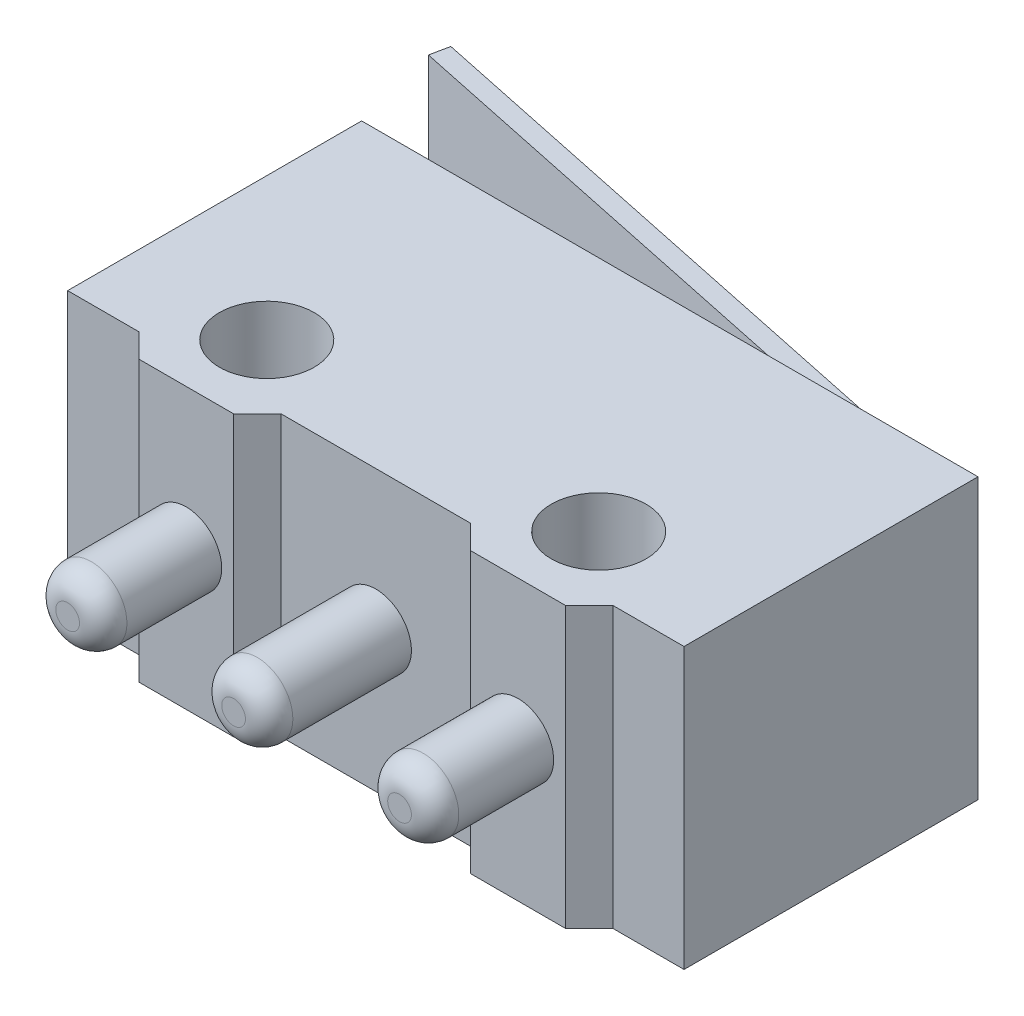
ISO-10303-21;
HEADER;
FILE_DESCRIPTION(('STEP AP214'),'2;1');
FILE_NAME('part.step','',(''),(''),'','','');
FILE_SCHEMA(('AUTOMOTIVE_DESIGN { 1 0 10303 214 1 1 1 1 }'));
ENDSEC;
DATA;
#1=APPLICATION_CONTEXT('core data for automotive mechanical design processes');
#2=APPLICATION_PROTOCOL_DEFINITION('international standard','automotive_design',2000,#1);
#3=PRODUCT_CONTEXT('',#1,'mechanical');
#4=PRODUCT('Part','Part','',(#3));
#5=PRODUCT_RELATED_PRODUCT_CATEGORY('part','',(#4));
#6=PRODUCT_DEFINITION_FORMATION('','',#4);
#7=PRODUCT_DEFINITION_CONTEXT('part definition',#1,'design');
#8=PRODUCT_DEFINITION('design','',#6,#7);
#9=PRODUCT_DEFINITION_SHAPE('','',#8);
#10=(LENGTH_UNIT() NAMED_UNIT(*) SI_UNIT(.MILLI.,.METRE.));
#11=(NAMED_UNIT(*) PLANE_ANGLE_UNIT() SI_UNIT($,.RADIAN.));
#12=(NAMED_UNIT(*) SI_UNIT($,.STERADIAN.) SOLID_ANGLE_UNIT());
#13=UNCERTAINTY_MEASURE_WITH_UNIT(LENGTH_MEASURE(1.E-05),#10,'distance_accuracy_value','');
#14=(GEOMETRIC_REPRESENTATION_CONTEXT(3) GLOBAL_UNCERTAINTY_ASSIGNED_CONTEXT((#13)) GLOBAL_UNIT_ASSIGNED_CONTEXT((#10,
#11,#12)) REPRESENTATION_CONTEXT('',''));
#15=CARTESIAN_POINT('',(0.,0.,0.));
#16=DIRECTION('',(0.,0.,1.));
#17=DIRECTION('',(1.,0.,0.));
#18=AXIS2_PLACEMENT_3D('',#15,#16,#17);
#19=CARTESIAN_POINT('',(5.9,2.95,-3.1));
#20=DIRECTION('',(-0.205748268842548,0.,0.978604950870521));
#21=DIRECTION('',(0.978604950870521,0.,0.205748268842548));
#22=AXIS2_PLACEMENT_3D('',#19,#20,#21);
#23=PLANE('',#22);
#24=DIRECTION('',(-0.978604950870521,0.,-0.205748268842548));
#25=VECTOR('',#24,1.);
#26=CARTESIAN_POINT('',(5.9,-2.45,-3.1));
#27=LINE('',#26,#25);
#28=CARTESIAN_POINT('',(5.9,-2.45,-3.1));
#29=VERTEX_POINT('',#28);
#30=CARTESIAN_POINT('',(-7.41770069246298,-2.45,-5.9));
#31=VERTEX_POINT('',#30);
#32=EDGE_CURVE('E394',#29,#31,#27,.T.);
#33=ORIENTED_EDGE('',*,*,#32,.T.);
#34=DIRECTION('',(0.,-1.,0.));
#35=VECTOR('',#34,1.);
#36=CARTESIAN_POINT('',(-7.41770069246298,2.95,-5.9));
#37=LINE('',#36,#35);
#38=CARTESIAN_POINT('',(-7.41770069246298,2.45,-5.9));
#39=VERTEX_POINT('',#38);
#40=EDGE_CURVE('E225',#39,#31,#37,.T.);
#41=ORIENTED_EDGE('',*,*,#40,.F.);
#42=DIRECTION('',(-0.978604950870521,0.,-0.205748268842548));
#43=VECTOR('',#42,1.);
#44=CARTESIAN_POINT('',(5.9,2.45,-3.1));
#45=LINE('',#44,#43);
#46=CARTESIAN_POINT('',(5.9,2.45,-3.1));
#47=VERTEX_POINT('',#46);
#48=EDGE_CURVE('E402',#47,#39,#45,.T.);
#49=ORIENTED_EDGE('',*,*,#48,.F.);
#50=DIRECTION('',(0.,-1.,0.));
#51=VECTOR('',#50,1.);
#52=CARTESIAN_POINT('',(5.9,2.95,-3.1));
#53=LINE('',#52,#51);
#54=EDGE_CURVE('E228',#47,#29,#53,.T.);
#55=ORIENTED_EDGE('',*,*,#54,.T.);
#56=EDGE_LOOP('',(#33,#41,#49,#55));
#57=FACE_BOUND('',#56,.T.);
#58=ADVANCED_FACE('F36',(#57),#23,.F.);
#59=CARTESIAN_POINT('',(-7.41770069246298,2.95,-5.9));
#60=DIRECTION('',(0.978604950870521,0.,0.205748268842546));
#61=DIRECTION('',(0.205748268842546,0.,-0.978604950870521));
#62=AXIS2_PLACEMENT_3D('',#59,#60,#61);
#63=PLANE('',#62);
#64=DIRECTION('',(-0.205748268842546,0.,0.978604950870521));
#65=VECTOR('',#64,1.);
#66=CARTESIAN_POINT('',(-7.41770069246298,-2.45,-5.9));
#67=LINE('',#66,#65);
#68=CARTESIAN_POINT('',(-7.5,-2.45,-5.50855801965179));
#69=VERTEX_POINT('',#68);
#70=EDGE_CURVE('E388',#31,#69,#67,.T.);
#71=ORIENTED_EDGE('',*,*,#70,.T.);
#72=DIRECTION('',(0.,-1.,0.));
#73=VECTOR('',#72,1.);
#74=CARTESIAN_POINT('',(-7.5,2.95,-5.50855801965179));
#75=LINE('',#74,#73);
#76=CARTESIAN_POINT('',(-7.5,2.45,-5.50855801965179));
#77=VERTEX_POINT('',#76);
#78=EDGE_CURVE('E222',#77,#69,#75,.T.);
#79=ORIENTED_EDGE('',*,*,#78,.F.);
#80=DIRECTION('',(-0.205748268842546,0.,0.978604950870521));
#81=VECTOR('',#80,1.);
#82=CARTESIAN_POINT('',(-7.41770069246298,2.45,-5.9));
#83=LINE('',#82,#81);
#84=EDGE_CURVE('E408',#39,#77,#83,.T.);
#85=ORIENTED_EDGE('',*,*,#84,.F.);
#86=ORIENTED_EDGE('',*,*,#40,.T.);
#87=EDGE_LOOP('',(#71,#79,#85,#86));
#88=FACE_BOUND('',#87,.T.);
#89=ADVANCED_FACE('F266',(#88),#63,.F.);
#90=CARTESIAN_POINT('',(-7.5,2.95,-5.50855801965179));
#91=DIRECTION('',(0.205748268842548,0.,-0.978604950870521));
#92=DIRECTION('',(-0.978604950870521,0.,-0.205748268842548));
#93=AXIS2_PLACEMENT_3D('',#90,#91,#92);
#94=PLANE('',#93);
#95=DIRECTION('',(0.978604950870521,0.,0.205748268842548));
#96=VECTOR('',#95,1.);
#97=CARTESIAN_POINT('',(-7.5,-2.45,-5.50855801965179));
#98=LINE('',#97,#96);
#99=CARTESIAN_POINT('',(3.95587671648355,-2.45,-3.1));
#100=VERTEX_POINT('',#99);
#101=EDGE_CURVE('E378',#69,#100,#98,.T.);
#102=ORIENTED_EDGE('',*,*,#101,.T.);
#103=DIRECTION('',(0.,-1.,0.));
#104=VECTOR('',#103,1.);
#105=CARTESIAN_POINT('',(3.95587671648355,2.95,-3.1));
#106=LINE('',#105,#104);
#107=CARTESIAN_POINT('',(3.95587671648355,2.45,-3.1));
#108=VERTEX_POINT('',#107);
#109=EDGE_CURVE('E220',#108,#100,#106,.T.);
#110=ORIENTED_EDGE('',*,*,#109,.F.);
#111=DIRECTION('',(0.978604950870521,0.,0.205748268842548));
#112=VECTOR('',#111,1.);
#113=CARTESIAN_POINT('',(-7.5,2.45,-5.50855801965179));
#114=LINE('',#113,#112);
#115=EDGE_CURVE('E410',#77,#108,#114,.T.);
#116=ORIENTED_EDGE('',*,*,#115,.F.);
#117=ORIENTED_EDGE('',*,*,#78,.T.);
#118=EDGE_LOOP('',(#102,#110,#116,#117));
#119=FACE_BOUND('',#118,.T.);
#120=ADVANCED_FACE('F272',(#119),#94,.F.);
#121=CARTESIAN_POINT('',(0.,-2.95,0.));
#122=DIRECTION('',(0.,1.,0.));
#123=DIRECTION('',(0.,0.,1.));
#124=AXIS2_PLACEMENT_3D('',#121,#122,#123);
#125=PLANE('',#124);
#126=CARTESIAN_POINT('',(-3.5,-2.95,1.9));
#127=DIRECTION('',(0.,1.,0.));
#128=DIRECTION('',(0.,0.,-1.));
#129=AXIS2_PLACEMENT_3D('',#126,#127,#128);
#130=CIRCLE('',#129,1.);
#131=CARTESIAN_POINT('',(-3.5,-2.95,0.9));
#132=VERTEX_POINT('',#131);
#133=EDGE_CURVE('E416',#132,#132,#130,.T.);
#134=ORIENTED_EDGE('',*,*,#133,.T.);
#135=EDGE_LOOP('',(#134));
#136=FACE_BOUND('',#135,.T.);
#137=CARTESIAN_POINT('',(3.5,-2.95,1.9));
#138=DIRECTION('',(0.,1.,0.));
#139=DIRECTION('',(0.,0.,1.));
#140=AXIS2_PLACEMENT_3D('',#137,#138,#139);
#141=CIRCLE('',#140,1.);
#142=CARTESIAN_POINT('',(3.5,-2.95,2.9));
#143=VERTEX_POINT('',#142);
#144=EDGE_CURVE('E315',#143,#143,#141,.T.);
#145=ORIENTED_EDGE('',*,*,#144,.T.);
#146=EDGE_LOOP('',(#145));
#147=FACE_BOUND('',#146,.T.);
#148=DIRECTION('',(-1.,0.,0.));
#149=VECTOR('',#148,1.);
#150=CARTESIAN_POINT('',(-6.5,-2.95,-3.1));
#151=LINE('',#150,#149);
#152=CARTESIAN_POINT('',(6.5,-2.95,-3.1));
#153=VERTEX_POINT('',#152);
#154=CARTESIAN_POINT('',(-6.5,-2.95,-3.1));
#155=VERTEX_POINT('',#154);
#156=EDGE_CURVE('E105',#153,#155,#151,.T.);
#157=ORIENTED_EDGE('',*,*,#156,.F.);
#158=DIRECTION('',(0.,0.,-1.));
#159=VECTOR('',#158,1.);
#160=CARTESIAN_POINT('',(6.5,-2.95,3.1));
#161=LINE('',#160,#159);
#162=CARTESIAN_POINT('',(6.5,-2.95,3.1));
#163=VERTEX_POINT('',#162);
#164=EDGE_CURVE('E190',#163,#153,#161,.T.);
#165=ORIENTED_EDGE('',*,*,#164,.F.);
#166=DIRECTION('',(1.,0.,0.));
#167=VECTOR('',#166,1.);
#168=CARTESIAN_POINT('',(5.,-2.95,3.1));
#169=LINE('',#168,#167);
#170=CARTESIAN_POINT('',(5.,-2.95,3.1));
#171=VERTEX_POINT('',#170);
#172=EDGE_CURVE('E188',#171,#163,#169,.T.);
#173=ORIENTED_EDGE('',*,*,#172,.F.);
#174=DIRECTION('',(0.707106781186546,0.,-0.707106781186549));
#175=VECTOR('',#174,1.);
#176=CARTESIAN_POINT('',(4.5,-2.95,3.6));
#177=LINE('',#176,#175);
#178=CARTESIAN_POINT('',(4.5,-2.95,3.6));
#179=VERTEX_POINT('',#178);
#180=EDGE_CURVE('E156',#179,#171,#177,.T.);
#181=ORIENTED_EDGE('',*,*,#180,.F.);
#182=DIRECTION('',(1.,0.,0.));
#183=VECTOR('',#182,1.);
#184=CARTESIAN_POINT('',(4.5,-2.95,3.6));
#185=LINE('',#184,#183);
#186=CARTESIAN_POINT('',(2.5,-2.95,3.6));
#187=VERTEX_POINT('',#186);
#188=EDGE_CURVE('E185',#187,#179,#185,.T.);
#189=ORIENTED_EDGE('',*,*,#188,.F.);
#190=DIRECTION('',(0.707106781186547,0.,0.707106781186548));
#191=VECTOR('',#190,1.);
#192=CARTESIAN_POINT('',(2.5,-2.95,3.6));
#193=LINE('',#192,#191);
#194=CARTESIAN_POINT('',(2.,-2.95,3.1));
#195=VERTEX_POINT('',#194);
#196=EDGE_CURVE('E183',#195,#187,#193,.T.);
#197=ORIENTED_EDGE('',*,*,#196,.F.);
#198=DIRECTION('',(1.,0.,0.));
#199=VECTOR('',#198,1.);
#200=CARTESIAN_POINT('',(-2.,-2.95,3.1));
#201=LINE('',#200,#199);
#202=CARTESIAN_POINT('',(-2.,-2.95,3.1));
#203=VERTEX_POINT('',#202);
#204=EDGE_CURVE('E181',#203,#195,#201,.T.);
#205=ORIENTED_EDGE('',*,*,#204,.F.);
#206=DIRECTION('',(0.707106781186547,0.,-0.707106781186548));
#207=VECTOR('',#206,1.);
#208=CARTESIAN_POINT('',(-2.5,-2.95,3.6));
#209=LINE('',#208,#207);
#210=CARTESIAN_POINT('',(-2.5,-2.95,3.6));
#211=VERTEX_POINT('',#210);
#212=EDGE_CURVE('E179',#211,#203,#209,.T.);
#213=ORIENTED_EDGE('',*,*,#212,.F.);
#214=DIRECTION('',(1.,0.,0.));
#215=VECTOR('',#214,1.);
#216=CARTESIAN_POINT('',(-4.5,-2.95,3.6));
#217=LINE('',#216,#215);
#218=CARTESIAN_POINT('',(-4.5,-2.95,3.6));
#219=VERTEX_POINT('',#218);
#220=EDGE_CURVE('E177',#219,#211,#217,.T.);
#221=ORIENTED_EDGE('',*,*,#220,.F.);
#222=DIRECTION('',(0.707106781186546,0.,0.707106781186549));
#223=VECTOR('',#222,1.);
#224=CARTESIAN_POINT('',(-4.5,-2.95,3.6));
#225=LINE('',#224,#223);
#226=CARTESIAN_POINT('',(-5.,-2.95,3.1));
#227=VERTEX_POINT('',#226);
#228=EDGE_CURVE('E175',#227,#219,#225,.T.);
#229=ORIENTED_EDGE('',*,*,#228,.F.);
#230=DIRECTION('',(1.,0.,0.));
#231=VECTOR('',#230,1.);
#232=CARTESIAN_POINT('',(-6.5,-2.95,3.1));
#233=LINE('',#232,#231);
#234=CARTESIAN_POINT('',(-6.5,-2.95,3.1));
#235=VERTEX_POINT('',#234);
#236=EDGE_CURVE('E173',#235,#227,#233,.T.);
#237=ORIENTED_EDGE('',*,*,#236,.F.);
#238=DIRECTION('',(0.,0.,1.));
#239=VECTOR('',#238,1.);
#240=CARTESIAN_POINT('',(-6.5,-2.95,3.1));
#241=LINE('',#240,#239);
#242=EDGE_CURVE('E170',#155,#235,#241,.T.);
#243=ORIENTED_EDGE('',*,*,#242,.F.);
#244=EDGE_LOOP('',(#157,#165,#173,#181,#189,#197,#205,#213,#221,#229,#237,#243));
#245=FACE_BOUND('',#244,.T.);
#246=ADVANCED_FACE('F304',(#136,#147,#245),#125,.F.);
#247=CARTESIAN_POINT('',(0.,2.95,0.));
#248=DIRECTION('',(0.,1.,0.));
#249=DIRECTION('',(0.,0.,1.));
#250=AXIS2_PLACEMENT_3D('',#247,#248,#249);
#251=PLANE('',#250);
#252=DIRECTION('',(-1.,0.,0.));
#253=VECTOR('',#252,1.);
#254=CARTESIAN_POINT('',(5.9,2.95,-3.1));
#255=LINE('',#254,#253);
#256=CARTESIAN_POINT('',(6.5,2.95,-3.1));
#257=VERTEX_POINT('',#256);
#258=CARTESIAN_POINT('',(-6.5,2.95,-3.1));
#259=VERTEX_POINT('',#258);
#260=EDGE_CURVE('E111',#257,#259,#255,.T.);
#261=ORIENTED_EDGE('',*,*,#260,.T.);
#262=DIRECTION('',(0.,0.,1.));
#263=VECTOR('',#262,1.);
#264=CARTESIAN_POINT('',(-6.5,2.95,3.1));
#265=LINE('',#264,#263);
#266=CARTESIAN_POINT('',(-6.5,2.95,3.1));
#267=VERTEX_POINT('',#266);
#268=EDGE_CURVE('E310',#259,#267,#265,.T.);
#269=ORIENTED_EDGE('',*,*,#268,.T.);
#270=DIRECTION('',(1.,0.,0.));
#271=VECTOR('',#270,1.);
#272=CARTESIAN_POINT('',(-6.5,2.95,3.1));
#273=LINE('',#272,#271);
#274=CARTESIAN_POINT('',(-5.,2.95,3.1));
#275=VERTEX_POINT('',#274);
#276=EDGE_CURVE('E312',#267,#275,#273,.T.);
#277=ORIENTED_EDGE('',*,*,#276,.T.);
#278=DIRECTION('',(0.707106781186546,0.,0.707106781186549));
#279=VECTOR('',#278,1.);
#280=CARTESIAN_POINT('',(-4.5,2.95,3.6));
#281=LINE('',#280,#279);
#282=CARTESIAN_POINT('',(-4.5,2.95,3.6));
#283=VERTEX_POINT('',#282);
#284=EDGE_CURVE('E319',#275,#283,#281,.T.);
#285=ORIENTED_EDGE('',*,*,#284,.T.);
#286=DIRECTION('',(1.,0.,0.));
#287=VECTOR('',#286,1.);
#288=CARTESIAN_POINT('',(-4.5,2.95,3.6));
#289=LINE('',#288,#287);
#290=CARTESIAN_POINT('',(-2.5,2.95,3.6));
#291=VERTEX_POINT('',#290);
#292=EDGE_CURVE('E321',#283,#291,#289,.T.);
#293=ORIENTED_EDGE('',*,*,#292,.T.);
#294=DIRECTION('',(0.707106781186547,0.,-0.707106781186548));
#295=VECTOR('',#294,1.);
#296=CARTESIAN_POINT('',(-2.5,2.95,3.6));
#297=LINE('',#296,#295);
#298=CARTESIAN_POINT('',(-2.,2.95,3.1));
#299=VERTEX_POINT('',#298);
#300=EDGE_CURVE('E323',#291,#299,#297,.T.);
#301=ORIENTED_EDGE('',*,*,#300,.T.);
#302=DIRECTION('',(1.,0.,0.));
#303=VECTOR('',#302,1.);
#304=CARTESIAN_POINT('',(-2.,2.95,3.1));
#305=LINE('',#304,#303);
#306=CARTESIAN_POINT('',(2.,2.95,3.1));
#307=VERTEX_POINT('',#306);
#308=EDGE_CURVE('E325',#299,#307,#305,.T.);
#309=ORIENTED_EDGE('',*,*,#308,.T.);
#310=DIRECTION('',(0.707106781186547,0.,0.707106781186548));
#311=VECTOR('',#310,1.);
#312=CARTESIAN_POINT('',(2.5,2.95,3.6));
#313=LINE('',#312,#311);
#314=CARTESIAN_POINT('',(2.5,2.95,3.6));
#315=VERTEX_POINT('',#314);
#316=EDGE_CURVE('E327',#307,#315,#313,.T.);
#317=ORIENTED_EDGE('',*,*,#316,.T.);
#318=DIRECTION('',(1.,0.,0.));
#319=VECTOR('',#318,1.);
#320=CARTESIAN_POINT('',(4.5,2.95,3.6));
#321=LINE('',#320,#319);
#322=CARTESIAN_POINT('',(4.5,2.95,3.6));
#323=VERTEX_POINT('',#322);
#324=EDGE_CURVE('E147',#315,#323,#321,.T.);
#325=ORIENTED_EDGE('',*,*,#324,.T.);
#326=DIRECTION('',(0.707106781186546,0.,-0.707106781186549));
#327=VECTOR('',#326,1.);
#328=CARTESIAN_POINT('',(4.5,2.95,3.6));
#329=LINE('',#328,#327);
#330=CARTESIAN_POINT('',(5.,2.95,3.1));
#331=VERTEX_POINT('',#330);
#332=EDGE_CURVE('E139',#323,#331,#329,.T.);
#333=ORIENTED_EDGE('',*,*,#332,.T.);
#334=DIRECTION('',(1.,0.,0.));
#335=VECTOR('',#334,1.);
#336=CARTESIAN_POINT('',(5.,2.95,3.1));
#337=LINE('',#336,#335);
#338=CARTESIAN_POINT('',(6.5,2.95,3.1));
#339=VERTEX_POINT('',#338);
#340=EDGE_CURVE('E144',#331,#339,#337,.T.);
#341=ORIENTED_EDGE('',*,*,#340,.T.);
#342=DIRECTION('',(0.,0.,-1.));
#343=VECTOR('',#342,1.);
#344=CARTESIAN_POINT('',(6.5,2.95,3.1));
#345=LINE('',#344,#343);
#346=EDGE_CURVE('E60',#339,#257,#345,.T.);
#347=ORIENTED_EDGE('',*,*,#346,.T.);
#348=EDGE_LOOP('',(#261,#269,#277,#285,#293,#301,#309,#317,#325,#333,#341,#347));
#349=FACE_BOUND('',#348,.T.);
#350=CARTESIAN_POINT('',(3.5,2.95,1.9));
#351=DIRECTION('',(0.,1.,0.));
#352=DIRECTION('',(0.,0.,1.));
#353=AXIS2_PLACEMENT_3D('',#350,#351,#352);
#354=CIRCLE('',#353,1.);
#355=CARTESIAN_POINT('',(3.5,2.95,2.9));
#356=VERTEX_POINT('',#355);
#357=EDGE_CURVE('E171',#356,#356,#354,.T.);
#358=ORIENTED_EDGE('',*,*,#357,.F.);
#359=EDGE_LOOP('',(#358));
#360=FACE_BOUND('',#359,.T.);
#361=CARTESIAN_POINT('',(-3.5,2.95,1.9));
#362=DIRECTION('',(0.,1.,0.));
#363=DIRECTION('',(0.,0.,-1.));
#364=AXIS2_PLACEMENT_3D('',#361,#362,#363);
#365=CIRCLE('',#364,1.);
#366=CARTESIAN_POINT('',(-3.5,2.95,0.9));
#367=VERTEX_POINT('',#366);
#368=EDGE_CURVE('E417',#367,#367,#365,.T.);
#369=ORIENTED_EDGE('',*,*,#368,.F.);
#370=EDGE_LOOP('',(#369));
#371=FACE_BOUND('',#370,.T.);
#372=ADVANCED_FACE('F141',(#349,#360,#371),#251,.T.);
#373=CARTESIAN_POINT('',(-6.5,2.95,-3.1));
#374=DIRECTION('',(0.,0.,1.));
#375=DIRECTION('',(1.,0.,0.));
#376=AXIS2_PLACEMENT_3D('',#373,#374,#375);
#377=PLANE('',#376);
#378=DIRECTION('',(0.,-1.,0.));
#379=VECTOR('',#378,1.);
#380=CARTESIAN_POINT('',(6.5,2.95,-3.1));
#381=LINE('',#380,#379);
#382=EDGE_CURVE('E165',#257,#153,#381,.T.);
#383=ORIENTED_EDGE('',*,*,#382,.T.);
#384=ORIENTED_EDGE('',*,*,#156,.T.);
#385=DIRECTION('',(0.,-1.,0.));
#386=VECTOR('',#385,1.);
#387=CARTESIAN_POINT('',(-6.5,2.95,-3.1));
#388=LINE('',#387,#386);
#389=EDGE_CURVE('E217',#259,#155,#388,.T.);
#390=ORIENTED_EDGE('',*,*,#389,.F.);
#391=ORIENTED_EDGE('',*,*,#260,.F.);
#392=EDGE_LOOP('',(#383,#384,#390,#391));
#393=FACE_BOUND('',#392,.T.);
#394=DIRECTION('',(1.,0.,0.));
#395=VECTOR('',#394,1.);
#396=CARTESIAN_POINT('',(5.9,-2.45,-3.1));
#397=LINE('',#396,#395);
#398=EDGE_CURVE('E389',#100,#29,#397,.T.);
#399=ORIENTED_EDGE('',*,*,#398,.T.);
#400=ORIENTED_EDGE('',*,*,#54,.F.);
#401=DIRECTION('',(1.,0.,0.));
#402=VECTOR('',#401,1.);
#403=CARTESIAN_POINT('',(5.9,2.45,-3.1));
#404=LINE('',#403,#402);
#405=EDGE_CURVE('E51',#108,#47,#404,.T.);
#406=ORIENTED_EDGE('',*,*,#405,.F.);
#407=ORIENTED_EDGE('',*,*,#109,.T.);
#408=EDGE_LOOP('',(#399,#400,#406,#407));
#409=FACE_BOUND('',#408,.T.);
#410=ADVANCED_FACE('F308',(#393,#409),#377,.F.);
#411=CARTESIAN_POINT('',(-6.5,2.95,3.1));
#412=DIRECTION('',(1.,0.,0.));
#413=DIRECTION('',(0.,0.,-1.));
#414=AXIS2_PLACEMENT_3D('',#411,#412,#413);
#415=PLANE('',#414);
#416=ORIENTED_EDGE('',*,*,#242,.T.);
#417=DIRECTION('',(0.,-1.,0.));
#418=VECTOR('',#417,1.);
#419=CARTESIAN_POINT('',(-6.5,2.95,3.1));
#420=LINE('',#419,#418);
#421=EDGE_CURVE('E214',#267,#235,#420,.T.);
#422=ORIENTED_EDGE('',*,*,#421,.F.);
#423=ORIENTED_EDGE('',*,*,#268,.F.);
#424=ORIENTED_EDGE('',*,*,#389,.T.);
#425=EDGE_LOOP('',(#416,#422,#423,#424));
#426=FACE_BOUND('',#425,.T.);
#427=ADVANCED_FACE('F357',(#426),#415,.F.);
#428=CARTESIAN_POINT('',(-6.5,2.95,3.1));
#429=DIRECTION('',(0.,0.,-1.));
#430=DIRECTION('',(-1.,0.,0.));
#431=AXIS2_PLACEMENT_3D('',#428,#429,#430);
#432=PLANE('',#431);
#433=ORIENTED_EDGE('',*,*,#236,.T.);
#434=DIRECTION('',(0.,-1.,0.));
#435=VECTOR('',#434,1.);
#436=CARTESIAN_POINT('',(-5.,2.95,3.1));
#437=LINE('',#436,#435);
#438=EDGE_CURVE('E211',#275,#227,#437,.T.);
#439=ORIENTED_EDGE('',*,*,#438,.F.);
#440=ORIENTED_EDGE('',*,*,#276,.F.);
#441=ORIENTED_EDGE('',*,*,#421,.T.);
#442=EDGE_LOOP('',(#433,#439,#440,#441));
#443=FACE_BOUND('',#442,.T.);
#444=ADVANCED_FACE('F354',(#443),#432,.F.);
#445=CARTESIAN_POINT('',(-4.5,2.95,3.6));
#446=DIRECTION('',(0.707106781186549,0.,-0.707106781186546));
#447=DIRECTION('',(-0.707106781186546,0.,-0.707106781186549));
#448=AXIS2_PLACEMENT_3D('',#445,#446,#447);
#449=PLANE('',#448);
#450=ORIENTED_EDGE('',*,*,#228,.T.);
#451=DIRECTION('',(0.,-1.,0.));
#452=VECTOR('',#451,1.);
#453=CARTESIAN_POINT('',(-4.5,2.95,3.6));
#454=LINE('',#453,#452);
#455=EDGE_CURVE('E208',#283,#219,#454,.T.);
#456=ORIENTED_EDGE('',*,*,#455,.F.);
#457=ORIENTED_EDGE('',*,*,#284,.F.);
#458=ORIENTED_EDGE('',*,*,#438,.T.);
#459=EDGE_LOOP('',(#450,#456,#457,#458));
#460=FACE_BOUND('',#459,.T.);
#461=ADVANCED_FACE('F349',(#460),#449,.F.);
#462=CARTESIAN_POINT('',(-4.5,2.95,3.6));
#463=DIRECTION('',(0.,0.,-1.));
#464=DIRECTION('',(-1.,0.,0.));
#465=AXIS2_PLACEMENT_3D('',#462,#463,#464);
#466=PLANE('',#465);
#467=CARTESIAN_POINT('',(-3.5,0.,3.6));
#468=DIRECTION('',(0.,0.,-1.));
#469=DIRECTION('',(-1.,0.,0.));
#470=AXIS2_PLACEMENT_3D('',#467,#468,#469);
#471=CIRCLE('',#470,0.75);
#472=CARTESIAN_POINT('',(-4.25,0.,3.6));
#473=VERTEX_POINT('',#472);
#474=EDGE_CURVE('E234',#473,#473,#471,.F.);
#475=ORIENTED_EDGE('',*,*,#474,.F.);
#476=EDGE_LOOP('',(#475));
#477=FACE_BOUND('',#476,.T.);
#478=ORIENTED_EDGE('',*,*,#220,.T.);
#479=DIRECTION('',(0.,-1.,0.));
#480=VECTOR('',#479,1.);
#481=CARTESIAN_POINT('',(-2.5,2.95,3.6));
#482=LINE('',#481,#480);
#483=EDGE_CURVE('E205',#291,#211,#482,.T.);
#484=ORIENTED_EDGE('',*,*,#483,.F.);
#485=ORIENTED_EDGE('',*,*,#292,.F.);
#486=ORIENTED_EDGE('',*,*,#455,.T.);
#487=EDGE_LOOP('',(#478,#484,#485,#486));
#488=FACE_BOUND('',#487,.T.);
#489=ADVANCED_FACE('F344',(#477,#488),#466,.F.);
#490=CARTESIAN_POINT('',(-2.5,2.95,3.6));
#491=DIRECTION('',(-0.707106781186548,0.,-0.707106781186547));
#492=DIRECTION('',(-0.707106781186547,0.,0.707106781186548));
#493=AXIS2_PLACEMENT_3D('',#490,#491,#492);
#494=PLANE('',#493);
#495=ORIENTED_EDGE('',*,*,#212,.T.);
#496=DIRECTION('',(0.,-1.,0.));
#497=VECTOR('',#496,1.);
#498=CARTESIAN_POINT('',(-2.,2.95,3.1));
#499=LINE('',#498,#497);
#500=EDGE_CURVE('E202',#299,#203,#499,.T.);
#501=ORIENTED_EDGE('',*,*,#500,.F.);
#502=ORIENTED_EDGE('',*,*,#300,.F.);
#503=ORIENTED_EDGE('',*,*,#483,.T.);
#504=EDGE_LOOP('',(#495,#501,#502,#503));
#505=FACE_BOUND('',#504,.T.);
#506=ADVANCED_FACE('F340',(#505),#494,.F.);
#507=CARTESIAN_POINT('',(-2.,2.95,3.1));
#508=DIRECTION('',(0.,0.,-1.));
#509=DIRECTION('',(-1.,0.,0.));
#510=AXIS2_PLACEMENT_3D('',#507,#508,#509);
#511=PLANE('',#510);
#512=CARTESIAN_POINT('',(0.,0.,3.1));
#513=DIRECTION('',(0.,0.,-1.));
#514=DIRECTION('',(-1.,0.,0.));
#515=AXIS2_PLACEMENT_3D('',#512,#513,#514);
#516=CIRCLE('',#515,0.75);
#517=CARTESIAN_POINT('',(-0.75,0.,3.1));
#518=VERTEX_POINT('',#517);
#519=EDGE_CURVE('E231',#518,#518,#516,.F.);
#520=ORIENTED_EDGE('',*,*,#519,.F.);
#521=EDGE_LOOP('',(#520));
#522=FACE_BOUND('',#521,.T.);
#523=ORIENTED_EDGE('',*,*,#204,.T.);
#524=DIRECTION('',(0.,-1.,0.));
#525=VECTOR('',#524,1.);
#526=CARTESIAN_POINT('',(2.,2.95,3.1));
#527=LINE('',#526,#525);
#528=EDGE_CURVE('E199',#307,#195,#527,.T.);
#529=ORIENTED_EDGE('',*,*,#528,.F.);
#530=ORIENTED_EDGE('',*,*,#308,.F.);
#531=ORIENTED_EDGE('',*,*,#500,.T.);
#532=EDGE_LOOP('',(#523,#529,#530,#531));
#533=FACE_BOUND('',#532,.T.);
#534=ADVANCED_FACE('F336',(#522,#533),#511,.F.);
#535=CARTESIAN_POINT('',(2.5,2.95,3.6));
#536=DIRECTION('',(0.707106781186548,0.,-0.707106781186547));
#537=DIRECTION('',(-0.707106781186547,0.,-0.707106781186548));
#538=AXIS2_PLACEMENT_3D('',#535,#536,#537);
#539=PLANE('',#538);
#540=ORIENTED_EDGE('',*,*,#196,.T.);
#541=DIRECTION('',(0.,-1.,0.));
#542=VECTOR('',#541,1.);
#543=CARTESIAN_POINT('',(2.5,2.95,3.6));
#544=LINE('',#543,#542);
#545=EDGE_CURVE('E196',#315,#187,#544,.T.);
#546=ORIENTED_EDGE('',*,*,#545,.F.);
#547=ORIENTED_EDGE('',*,*,#316,.F.);
#548=ORIENTED_EDGE('',*,*,#528,.T.);
#549=EDGE_LOOP('',(#540,#546,#547,#548));
#550=FACE_BOUND('',#549,.T.);
#551=ADVANCED_FACE('F299',(#550),#539,.F.);
#552=CARTESIAN_POINT('',(4.5,2.95,3.6));
#553=DIRECTION('',(0.,0.,-1.));
#554=DIRECTION('',(-1.,0.,0.));
#555=AXIS2_PLACEMENT_3D('',#552,#553,#554);
#556=PLANE('',#555);
#557=CARTESIAN_POINT('',(3.5,0.,3.6));
#558=DIRECTION('',(0.,0.,-1.));
#559=DIRECTION('',(-1.,0.,0.));
#560=AXIS2_PLACEMENT_3D('',#557,#558,#559);
#561=CIRCLE('',#560,0.750000000000001);
#562=CARTESIAN_POINT('',(2.75,0.,3.6));
#563=VERTEX_POINT('',#562);
#564=EDGE_CURVE('E237',#563,#563,#561,.F.);
#565=ORIENTED_EDGE('',*,*,#564,.F.);
#566=EDGE_LOOP('',(#565));
#567=FACE_BOUND('',#566,.T.);
#568=ORIENTED_EDGE('',*,*,#188,.T.);
#569=DIRECTION('',(0.,-1.,0.));
#570=VECTOR('',#569,1.);
#571=CARTESIAN_POINT('',(4.5,2.95,3.6));
#572=LINE('',#571,#570);
#573=EDGE_CURVE('E159',#323,#179,#572,.T.);
#574=ORIENTED_EDGE('',*,*,#573,.F.);
#575=ORIENTED_EDGE('',*,*,#324,.F.);
#576=ORIENTED_EDGE('',*,*,#545,.T.);
#577=EDGE_LOOP('',(#568,#574,#575,#576));
#578=FACE_BOUND('',#577,.T.);
#579=ADVANCED_FACE('F296',(#567,#578),#556,.F.);
#580=CARTESIAN_POINT('',(4.5,2.95,3.6));
#581=DIRECTION('',(-0.707106781186549,0.,-0.707106781186546));
#582=DIRECTION('',(-0.707106781186546,0.,0.707106781186549));
#583=AXIS2_PLACEMENT_3D('',#580,#581,#582);
#584=PLANE('',#583);
#585=ORIENTED_EDGE('',*,*,#180,.T.);
#586=DIRECTION('',(0.,-1.,0.));
#587=VECTOR('',#586,1.);
#588=CARTESIAN_POINT('',(5.,2.95,3.1));
#589=LINE('',#588,#587);
#590=EDGE_CURVE('E153',#331,#171,#589,.T.);
#591=ORIENTED_EDGE('',*,*,#590,.F.);
#592=ORIENTED_EDGE('',*,*,#332,.F.);
#593=ORIENTED_EDGE('',*,*,#573,.T.);
#594=EDGE_LOOP('',(#585,#591,#592,#593));
#595=FACE_BOUND('',#594,.T.);
#596=ADVANCED_FACE('F154',(#595),#584,.F.);
#597=CARTESIAN_POINT('',(5.,2.95,3.1));
#598=DIRECTION('',(0.,0.,-1.));
#599=DIRECTION('',(-1.,0.,0.));
#600=AXIS2_PLACEMENT_3D('',#597,#598,#599);
#601=PLANE('',#600);
#602=ORIENTED_EDGE('',*,*,#172,.T.);
#603=DIRECTION('',(0.,-1.,0.));
#604=VECTOR('',#603,1.);
#605=CARTESIAN_POINT('',(6.5,2.95,3.1));
#606=LINE('',#605,#604);
#607=EDGE_CURVE('E160',#339,#163,#606,.T.);
#608=ORIENTED_EDGE('',*,*,#607,.F.);
#609=ORIENTED_EDGE('',*,*,#340,.F.);
#610=ORIENTED_EDGE('',*,*,#590,.T.);
#611=EDGE_LOOP('',(#602,#608,#609,#610));
#612=FACE_BOUND('',#611,.T.);
#613=ADVANCED_FACE('F162',(#612),#601,.F.);
#614=CARTESIAN_POINT('',(6.5,2.95,3.1));
#615=DIRECTION('',(-1.,0.,0.));
#616=DIRECTION('',(0.,0.,1.));
#617=AXIS2_PLACEMENT_3D('',#614,#615,#616);
#618=PLANE('',#617);
#619=ORIENTED_EDGE('',*,*,#164,.T.);
#620=ORIENTED_EDGE('',*,*,#382,.F.);
#621=ORIENTED_EDGE('',*,*,#346,.F.);
#622=ORIENTED_EDGE('',*,*,#607,.T.);
#623=EDGE_LOOP('',(#619,#620,#621,#622));
#624=FACE_BOUND('',#623,.T.);
#625=ADVANCED_FACE('F306',(#624),#618,.F.);
#626=CARTESIAN_POINT('',(3.5,2.95,1.9));
#627=DIRECTION('',(0.,-1.,0.));
#628=DIRECTION('',(0.,0.,-1.));
#629=AXIS2_PLACEMENT_3D('',#626,#627,#628);
#630=CYLINDRICAL_SURFACE('',#629,1.);
#631=ORIENTED_EDGE('',*,*,#357,.T.);
#632=EDGE_LOOP('',(#631));
#633=FACE_BOUND('',#632,.T.);
#634=ORIENTED_EDGE('',*,*,#144,.F.);
#635=EDGE_LOOP('',(#634));
#636=FACE_BOUND('',#635,.T.);
#637=ADVANCED_FACE('F428',(#633,#636),#630,.F.);
#638=CARTESIAN_POINT('',(-3.5,2.95,1.9));
#639=DIRECTION('',(0.,-1.,0.));
#640=DIRECTION('',(0.,0.,-1.));
#641=AXIS2_PLACEMENT_3D('',#638,#639,#640);
#642=CYLINDRICAL_SURFACE('',#641,1.);
#643=ORIENTED_EDGE('',*,*,#368,.T.);
#644=EDGE_LOOP('',(#643));
#645=FACE_BOUND('',#644,.T.);
#646=ORIENTED_EDGE('',*,*,#133,.F.);
#647=EDGE_LOOP('',(#646));
#648=FACE_BOUND('',#647,.T.);
#649=ADVANCED_FACE('F430',(#645,#648),#642,.F.);
#650=CARTESIAN_POINT('',(0.,2.45,0.));
#651=DIRECTION('',(0.,1.,0.));
#652=DIRECTION('',(0.,0.,1.));
#653=AXIS2_PLACEMENT_3D('',#650,#651,#652);
#654=PLANE('',#653);
#655=ORIENTED_EDGE('',*,*,#48,.T.);
#656=ORIENTED_EDGE('',*,*,#84,.T.);
#657=ORIENTED_EDGE('',*,*,#115,.T.);
#658=ORIENTED_EDGE('',*,*,#405,.T.);
#659=EDGE_LOOP('',(#655,#656,#657,#658));
#660=FACE_BOUND('',#659,.T.);
#661=ADVANCED_FACE('F436',(#660),#654,.T.);
#662=CARTESIAN_POINT('',(0.,-2.45,0.));
#663=DIRECTION('',(0.,-1.,0.));
#664=DIRECTION('',(0.,0.,1.));
#665=AXIS2_PLACEMENT_3D('',#662,#663,#664);
#666=PLANE('',#665);
#667=ORIENTED_EDGE('',*,*,#32,.F.);
#668=ORIENTED_EDGE('',*,*,#398,.F.);
#669=ORIENTED_EDGE('',*,*,#101,.F.);
#670=ORIENTED_EDGE('',*,*,#70,.F.);
#671=EDGE_LOOP('',(#667,#668,#669,#670));
#672=FACE_BOUND('',#671,.T.);
#673=ADVANCED_FACE('F396',(#672),#666,.T.);
#674=CARTESIAN_POINT('',(0.,0.,6.1));
#675=DIRECTION('',(0.,0.,-1.));
#676=DIRECTION('',(-1.,0.,0.));
#677=AXIS2_PLACEMENT_3D('',#674,#675,#676);
#678=CYLINDRICAL_SURFACE('',#677,0.75);
#679=CARTESIAN_POINT('',(0.,0.,5.6));
#680=DIRECTION('',(0.,0.,1.));
#681=DIRECTION('',(1.,0.,0.));
#682=AXIS2_PLACEMENT_3D('',#679,#680,#681);
#683=CIRCLE('',#682,0.75);
#684=CARTESIAN_POINT('',(0.75,0.,5.6));
#685=VERTEX_POINT('',#684);
#686=EDGE_CURVE('E249',#685,#685,#683,.F.);
#687=ORIENTED_EDGE('',*,*,#686,.T.);
#688=EDGE_LOOP('',(#687));
#689=FACE_BOUND('',#688,.T.);
#690=ORIENTED_EDGE('',*,*,#519,.T.);
#691=EDGE_LOOP('',(#690));
#692=FACE_BOUND('',#691,.T.);
#693=ADVANCED_FACE('F555',(#689,#692),#678,.T.);
#694=CARTESIAN_POINT('',(0.,0.,6.1));
#695=DIRECTION('',(0.,0.,1.));
#696=DIRECTION('',(1.,0.,0.));
#697=AXIS2_PLACEMENT_3D('',#694,#695,#696);
#698=PLANE('',#697);
#699=CARTESIAN_POINT('',(0.,0.,6.1));
#700=DIRECTION('',(0.,0.,1.));
#701=DIRECTION('',(1.,0.,0.));
#702=AXIS2_PLACEMENT_3D('',#699,#700,#701);
#703=CIRCLE('',#702,0.25);
#704=CARTESIAN_POINT('',(0.25,0.,6.1));
#705=VERTEX_POINT('',#704);
#706=EDGE_CURVE('E246',#705,#705,#703,.T.);
#707=ORIENTED_EDGE('',*,*,#706,.T.);
#708=EDGE_LOOP('',(#707));
#709=FACE_BOUND('',#708,.T.);
#710=ADVANCED_FACE('F564',(#709),#698,.T.);
#711=CARTESIAN_POINT('',(-3.5,0.,6.1));
#712=DIRECTION('',(0.,0.,-1.));
#713=DIRECTION('',(-1.,0.,0.));
#714=AXIS2_PLACEMENT_3D('',#711,#712,#713);
#715=CYLINDRICAL_SURFACE('',#714,0.75);
#716=CARTESIAN_POINT('',(-3.5,0.,5.6));
#717=DIRECTION('',(0.,0.,1.));
#718=DIRECTION('',(1.,0.,0.));
#719=AXIS2_PLACEMENT_3D('',#716,#717,#718);
#720=CIRCLE('',#719,0.75);
#721=CARTESIAN_POINT('',(-2.75,0.,5.6));
#722=VERTEX_POINT('',#721);
#723=EDGE_CURVE('E11',#722,#722,#720,.F.);
#724=ORIENTED_EDGE('',*,*,#723,.T.);
#725=EDGE_LOOP('',(#724));
#726=FACE_BOUND('',#725,.T.);
#727=ORIENTED_EDGE('',*,*,#474,.T.);
#728=EDGE_LOOP('',(#727));
#729=FACE_BOUND('',#728,.T.);
#730=ADVANCED_FACE('F571',(#726,#729),#715,.T.);
#731=CARTESIAN_POINT('',(-3.5,0.,6.1));
#732=DIRECTION('',(0.,0.,1.));
#733=DIRECTION('',(1.,0.,0.));
#734=AXIS2_PLACEMENT_3D('',#731,#732,#733);
#735=PLANE('',#734);
#736=CARTESIAN_POINT('',(-3.5,0.,6.1));
#737=DIRECTION('',(0.,0.,1.));
#738=DIRECTION('',(1.,0.,0.));
#739=AXIS2_PLACEMENT_3D('',#736,#737,#738);
#740=CIRCLE('',#739,0.25);
#741=CARTESIAN_POINT('',(-3.25,0.,6.1));
#742=VERTEX_POINT('',#741);
#743=EDGE_CURVE('E44',#742,#742,#740,.T.);
#744=ORIENTED_EDGE('',*,*,#743,.T.);
#745=EDGE_LOOP('',(#744));
#746=FACE_BOUND('',#745,.T.);
#747=ADVANCED_FACE('F254',(#746),#735,.T.);
#748=CARTESIAN_POINT('',(3.5,0.,6.1));
#749=DIRECTION('',(0.,0.,-1.));
#750=DIRECTION('',(-1.,0.,0.));
#751=AXIS2_PLACEMENT_3D('',#748,#749,#750);
#752=CYLINDRICAL_SURFACE('',#751,0.750000000000001);
#753=CARTESIAN_POINT('',(3.5,0.,5.6));
#754=DIRECTION('',(0.,0.,-1.));
#755=DIRECTION('',(-1.,0.,0.));
#756=AXIS2_PLACEMENT_3D('',#753,#754,#755);
#757=CIRCLE('',#756,0.750000000000001);
#758=CARTESIAN_POINT('',(2.75,0.,5.6));
#759=VERTEX_POINT('',#758);
#760=EDGE_CURVE('E243',#759,#759,#757,.T.);
#761=ORIENTED_EDGE('',*,*,#760,.T.);
#762=EDGE_LOOP('',(#761));
#763=FACE_BOUND('',#762,.T.);
#764=ORIENTED_EDGE('',*,*,#564,.T.);
#765=EDGE_LOOP('',(#764));
#766=FACE_BOUND('',#765,.T.);
#767=ADVANCED_FACE('F284',(#763,#766),#752,.T.);
#768=CARTESIAN_POINT('',(3.5,0.,6.1));
#769=DIRECTION('',(0.,0.,-1.));
#770=DIRECTION('',(-1.,0.,0.));
#771=AXIS2_PLACEMENT_3D('',#768,#769,#770);
#772=PLANE('',#771);
#773=CARTESIAN_POINT('',(3.5,0.,6.1));
#774=DIRECTION('',(0.,0.,-1.));
#775=DIRECTION('',(-1.,0.,0.));
#776=AXIS2_PLACEMENT_3D('',#773,#774,#775);
#777=CIRCLE('',#776,0.250000000000001);
#778=CARTESIAN_POINT('',(3.25,0.,6.1));
#779=VERTEX_POINT('',#778);
#780=EDGE_CURVE('E240',#779,#779,#777,.F.);
#781=ORIENTED_EDGE('',*,*,#780,.T.);
#782=EDGE_LOOP('',(#781));
#783=FACE_BOUND('',#782,.T.);
#784=ADVANCED_FACE('F279',(#783),#772,.F.);
#785=CARTESIAN_POINT('',(3.5,0.,5.6));
#786=DIRECTION('',(0.,0.,-1.));
#787=DIRECTION('',(-1.,0.,0.));
#788=AXIS2_PLACEMENT_3D('',#785,#786,#787);
#789=DEGENERATE_TOROIDAL_SURFACE('',#788,0.250000000000001,0.5,.T.);
#790=ORIENTED_EDGE('',*,*,#760,.F.);
#791=EDGE_LOOP('',(#790));
#792=FACE_BOUND('',#791,.T.);
#793=ORIENTED_EDGE('',*,*,#780,.F.);
#794=EDGE_LOOP('',(#793));
#795=FACE_BOUND('',#794,.T.);
#796=ADVANCED_FACE('F262',(#792,#795),#789,.T.);
#797=CARTESIAN_POINT('',(0.,0.,5.6));
#798=DIRECTION('',(0.,0.,1.));
#799=DIRECTION('',(1.,0.,0.));
#800=AXIS2_PLACEMENT_3D('',#797,#798,#799);
#801=DEGENERATE_TOROIDAL_SURFACE('',#800,0.25,0.5,.T.);
#802=ORIENTED_EDGE('',*,*,#686,.F.);
#803=EDGE_LOOP('',(#802));
#804=FACE_BOUND('',#803,.T.);
#805=ORIENTED_EDGE('',*,*,#706,.F.);
#806=EDGE_LOOP('',(#805));
#807=FACE_BOUND('',#806,.T.);
#808=ADVANCED_FACE('F257',(#804,#807),#801,.T.);
#809=CARTESIAN_POINT('',(-3.5,0.,5.6));
#810=DIRECTION('',(0.,0.,1.));
#811=DIRECTION('',(1.,0.,0.));
#812=AXIS2_PLACEMENT_3D('',#809,#810,#811);
#813=DEGENERATE_TOROIDAL_SURFACE('',#812,0.25,0.5,.T.);
#814=ORIENTED_EDGE('',*,*,#723,.F.);
#815=EDGE_LOOP('',(#814));
#816=FACE_BOUND('',#815,.T.);
#817=ORIENTED_EDGE('',*,*,#743,.F.);
#818=EDGE_LOOP('',(#817));
#819=FACE_BOUND('',#818,.T.);
#820=ADVANCED_FACE('F38',(#816,#819),#813,.T.);
#821=CLOSED_SHELL('',(#58,#89,#120,#246,#372,#410,#427,#444,#461,#489,#506,#534,#551,#579,#596,
#613,#625,#637,#649,#661,#673,#693,#710,#730,#747,#767,#784,#796,#808,#820));
#822=MANIFOLD_SOLID_BREP('B2',#821);
#823=ADVANCED_BREP_SHAPE_REPRESENTATION('',(#18,#822),#14);
#824=SHAPE_DEFINITION_REPRESENTATION(#9,#823);
ENDSEC;
END-ISO-10303-21;
